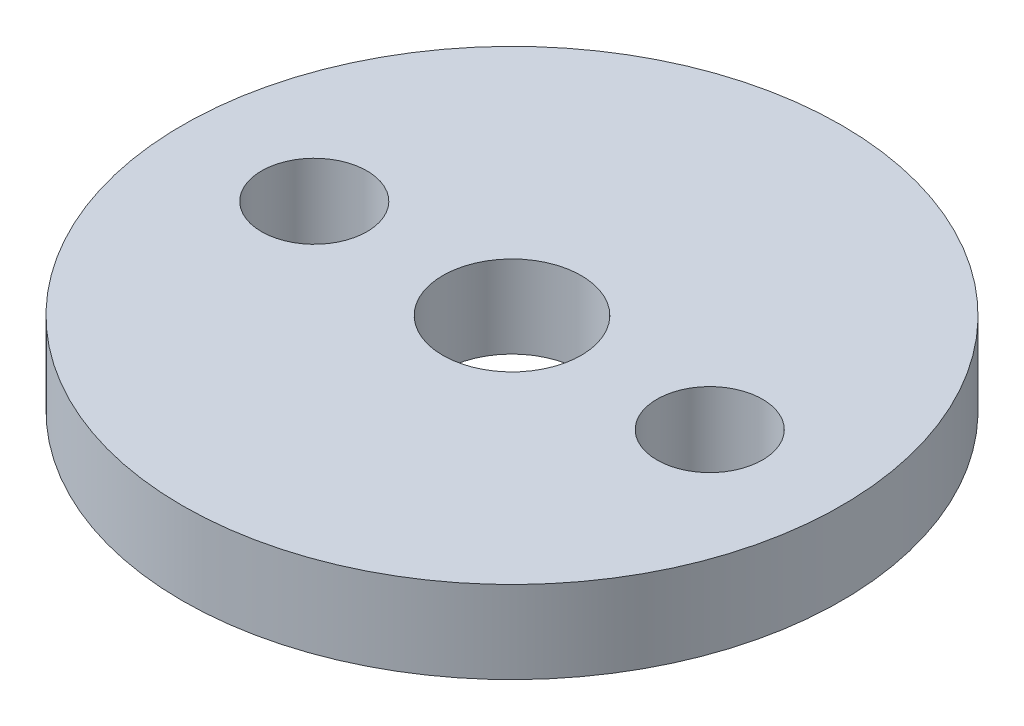
ISO-10303-21;
HEADER;
FILE_DESCRIPTION(('STEP AP214'),'2;1');
FILE_NAME('part.step','',(''),(''),'','','');
FILE_SCHEMA(('AUTOMOTIVE_DESIGN { 1 0 10303 214 1 1 1 1 }'));
ENDSEC;
DATA;
#1=APPLICATION_CONTEXT('core data for automotive mechanical design processes');
#2=APPLICATION_PROTOCOL_DEFINITION('international standard','automotive_design',2000,#1);
#3=PRODUCT_CONTEXT('',#1,'mechanical');
#4=PRODUCT('Part','Part','',(#3));
#5=PRODUCT_RELATED_PRODUCT_CATEGORY('part','',(#4));
#6=PRODUCT_DEFINITION_FORMATION('','',#4);
#7=PRODUCT_DEFINITION_CONTEXT('part definition',#1,'design');
#8=PRODUCT_DEFINITION('design','',#6,#7);
#9=PRODUCT_DEFINITION_SHAPE('','',#8);
#10=(LENGTH_UNIT() NAMED_UNIT(*) SI_UNIT(.MILLI.,.METRE.));
#11=(NAMED_UNIT(*) PLANE_ANGLE_UNIT() SI_UNIT($,.RADIAN.));
#12=(NAMED_UNIT(*) SI_UNIT($,.STERADIAN.) SOLID_ANGLE_UNIT());
#13=UNCERTAINTY_MEASURE_WITH_UNIT(LENGTH_MEASURE(1.E-05),#10,'distance_accuracy_value','');
#14=(GEOMETRIC_REPRESENTATION_CONTEXT(3) GLOBAL_UNCERTAINTY_ASSIGNED_CONTEXT((#13)) GLOBAL_UNIT_ASSIGNED_CONTEXT((#10,
#11,#12)) REPRESENTATION_CONTEXT('',''));
#15=CARTESIAN_POINT('',(0.,0.,0.));
#16=DIRECTION('',(0.,0.,1.));
#17=DIRECTION('',(1.,0.,0.));
#18=AXIS2_PLACEMENT_3D('',#15,#16,#17);
#19=CARTESIAN_POINT('',(0.,2.5,0.));
#20=DIRECTION('',(0.,-1.,0.));
#21=DIRECTION('',(0.,0.,-1.));
#22=AXIS2_PLACEMENT_3D('',#19,#20,#21);
#23=CYLINDRICAL_SURFACE('',#22,10.);
#24=CARTESIAN_POINT('',(0.,2.5,0.));
#25=DIRECTION('',(0.,1.,0.));
#26=DIRECTION('',(0.,0.,1.));
#27=AXIS2_PLACEMENT_3D('',#24,#25,#26);
#28=CIRCLE('',#27,10.);
#29=CARTESIAN_POINT('',(0.,2.5,10.));
#30=VERTEX_POINT('',#29);
#31=EDGE_CURVE('E10',#30,#30,#28,.T.);
#32=ORIENTED_EDGE('',*,*,#31,.F.);
#33=EDGE_LOOP('',(#32));
#34=FACE_BOUND('',#33,.T.);
#35=CARTESIAN_POINT('',(0.,0.,0.));
#36=DIRECTION('',(0.,1.,0.));
#37=DIRECTION('',(0.,0.,1.));
#38=AXIS2_PLACEMENT_3D('',#35,#36,#37);
#39=CIRCLE('',#38,10.);
#40=CARTESIAN_POINT('',(0.,0.,10.));
#41=VERTEX_POINT('',#40);
#42=EDGE_CURVE('E44',#41,#41,#39,.T.);
#43=ORIENTED_EDGE('',*,*,#42,.T.);
#44=EDGE_LOOP('',(#43));
#45=FACE_BOUND('',#44,.T.);
#46=ADVANCED_FACE('F37',(#34,#45),#23,.T.);
#47=CARTESIAN_POINT('',(0.,2.5,0.));
#48=DIRECTION('',(0.,1.,0.));
#49=DIRECTION('',(0.,0.,1.));
#50=AXIS2_PLACEMENT_3D('',#47,#48,#49);
#51=PLANE('',#50);
#52=CARTESIAN_POINT('',(-6.,2.5,0.));
#53=DIRECTION('',(0.,1.,0.));
#54=DIRECTION('',(0.,0.,1.));
#55=AXIS2_PLACEMENT_3D('',#52,#53,#54);
#56=CIRCLE('',#55,1.6);
#57=CARTESIAN_POINT('',(-6.,2.5,1.6));
#58=VERTEX_POINT('',#57);
#59=EDGE_CURVE('E104',#58,#58,#56,.T.);
#60=ORIENTED_EDGE('',*,*,#59,.F.);
#61=EDGE_LOOP('',(#60));
#62=FACE_BOUND('',#61,.T.);
#63=CARTESIAN_POINT('',(6.,2.5,0.));
#64=DIRECTION('',(0.,1.,0.));
#65=DIRECTION('',(0.,0.,1.));
#66=AXIS2_PLACEMENT_3D('',#63,#64,#65);
#67=CIRCLE('',#66,1.6);
#68=CARTESIAN_POINT('',(6.,2.5,1.6));
#69=VERTEX_POINT('',#68);
#70=EDGE_CURVE('E102',#69,#69,#67,.T.);
#71=ORIENTED_EDGE('',*,*,#70,.F.);
#72=EDGE_LOOP('',(#71));
#73=FACE_BOUND('',#72,.T.);
#74=CARTESIAN_POINT('',(0.,2.5,0.));
#75=DIRECTION('',(0.,1.,0.));
#76=DIRECTION('',(0.,0.,1.));
#77=AXIS2_PLACEMENT_3D('',#74,#75,#76);
#78=CIRCLE('',#77,2.1);
#79=CARTESIAN_POINT('',(0.,2.5,2.1));
#80=VERTEX_POINT('',#79);
#81=EDGE_CURVE('E51',#80,#80,#78,.T.);
#82=ORIENTED_EDGE('',*,*,#81,.F.);
#83=EDGE_LOOP('',(#82));
#84=FACE_BOUND('',#83,.T.);
#85=ORIENTED_EDGE('',*,*,#31,.T.);
#86=EDGE_LOOP('',(#85));
#87=FACE_BOUND('',#86,.T.);
#88=ADVANCED_FACE('F79',(#62,#73,#84,#87),#51,.T.);
#89=CARTESIAN_POINT('',(0.,0.,0.));
#90=DIRECTION('',(0.,1.,0.));
#91=DIRECTION('',(0.,0.,1.));
#92=AXIS2_PLACEMENT_3D('',#89,#90,#91);
#93=PLANE('',#92);
#94=CARTESIAN_POINT('',(-6.,0.,0.));
#95=DIRECTION('',(0.,1.,0.));
#96=DIRECTION('',(0.,0.,1.));
#97=AXIS2_PLACEMENT_3D('',#94,#95,#96);
#98=CIRCLE('',#97,1.6);
#99=CARTESIAN_POINT('',(-6.,0.,1.6));
#100=VERTEX_POINT('',#99);
#101=EDGE_CURVE('E40',#100,#100,#98,.T.);
#102=ORIENTED_EDGE('',*,*,#101,.T.);
#103=EDGE_LOOP('',(#102));
#104=FACE_BOUND('',#103,.T.);
#105=CARTESIAN_POINT('',(6.,0.,0.));
#106=DIRECTION('',(0.,1.,0.));
#107=DIRECTION('',(0.,0.,1.));
#108=AXIS2_PLACEMENT_3D('',#105,#106,#107);
#109=CIRCLE('',#108,1.6);
#110=CARTESIAN_POINT('',(6.,0.,1.6));
#111=VERTEX_POINT('',#110);
#112=EDGE_CURVE('E56',#111,#111,#109,.T.);
#113=ORIENTED_EDGE('',*,*,#112,.T.);
#114=EDGE_LOOP('',(#113));
#115=FACE_BOUND('',#114,.T.);
#116=CARTESIAN_POINT('',(0.,0.,0.));
#117=DIRECTION('',(0.,1.,0.));
#118=DIRECTION('',(0.,0.,1.));
#119=AXIS2_PLACEMENT_3D('',#116,#117,#118);
#120=CIRCLE('',#119,2.1);
#121=CARTESIAN_POINT('',(0.,0.,2.1));
#122=VERTEX_POINT('',#121);
#123=EDGE_CURVE('E54',#122,#122,#120,.T.);
#124=ORIENTED_EDGE('',*,*,#123,.T.);
#125=EDGE_LOOP('',(#124));
#126=FACE_BOUND('',#125,.T.);
#127=ORIENTED_EDGE('',*,*,#42,.F.);
#128=EDGE_LOOP('',(#127));
#129=FACE_BOUND('',#128,.T.);
#130=ADVANCED_FACE('F63',(#104,#115,#126,#129),#93,.F.);
#131=CARTESIAN_POINT('',(0.,-1.2E-05,0.));
#132=DIRECTION('',(0.,1.,0.));
#133=DIRECTION('',(0.,0.,1.));
#134=AXIS2_PLACEMENT_3D('',#131,#132,#133);
#135=CYLINDRICAL_SURFACE('',#134,2.1);
#136=CARTESIAN_POINT('',(0.,2.5,2.1));
#137=CARTESIAN_POINT('',(0.,2.47395833333333,2.1));
#138=CARTESIAN_POINT('',(0.,2.44791666666667,2.1));
#139=CARTESIAN_POINT('',(0.,2.39583333333333,2.1));
#140=CARTESIAN_POINT('',(0.,2.36979166666667,2.1));
#141=CARTESIAN_POINT('',(0.,2.31770833333333,2.1));
#142=CARTESIAN_POINT('',(0.,2.29166666666667,2.1));
#143=CARTESIAN_POINT('',(0.,2.23958333333333,2.1));
#144=CARTESIAN_POINT('',(0.,2.21354166666667,2.1));
#145=CARTESIAN_POINT('',(0.,2.16145833333333,2.1));
#146=CARTESIAN_POINT('',(0.,2.13541666666667,2.1));
#147=CARTESIAN_POINT('',(0.,2.08333333333333,2.1));
#148=CARTESIAN_POINT('',(0.,2.05729166666667,2.1));
#149=CARTESIAN_POINT('',(0.,2.00520833333333,2.1));
#150=CARTESIAN_POINT('',(0.,1.97916666666667,2.1));
#151=CARTESIAN_POINT('',(0.,1.92708333333333,2.1));
#152=CARTESIAN_POINT('',(0.,1.90104166666667,2.1));
#153=CARTESIAN_POINT('',(0.,1.84895833333333,2.1));
#154=CARTESIAN_POINT('',(0.,1.82291666666667,2.1));
#155=CARTESIAN_POINT('',(0.,1.77083333333333,2.1));
#156=CARTESIAN_POINT('',(0.,1.74479166666667,2.1));
#157=CARTESIAN_POINT('',(0.,1.69270833333333,2.1));
#158=CARTESIAN_POINT('',(0.,1.66666666666667,2.1));
#159=CARTESIAN_POINT('',(0.,1.61458333333333,2.1));
#160=CARTESIAN_POINT('',(0.,1.58854166666667,2.1));
#161=CARTESIAN_POINT('',(0.,1.53645833333333,2.1));
#162=CARTESIAN_POINT('',(0.,1.51041666666667,2.1));
#163=CARTESIAN_POINT('',(0.,1.45833333333333,2.1));
#164=CARTESIAN_POINT('',(0.,1.43229166666667,2.1));
#165=CARTESIAN_POINT('',(0.,1.38020833333333,2.1));
#166=CARTESIAN_POINT('',(0.,1.35416666666667,2.1));
#167=CARTESIAN_POINT('',(0.,1.30208333333333,2.1));
#168=CARTESIAN_POINT('',(0.,1.27604166666667,2.1));
#169=CARTESIAN_POINT('',(0.,1.22395833333333,2.1));
#170=CARTESIAN_POINT('',(0.,1.19791666666667,2.1));
#171=CARTESIAN_POINT('',(0.,1.14583333333333,2.1));
#172=CARTESIAN_POINT('',(0.,1.11979166666667,2.1));
#173=CARTESIAN_POINT('',(0.,1.06770833333333,2.1));
#174=CARTESIAN_POINT('',(0.,1.04166666666667,2.1));
#175=CARTESIAN_POINT('',(0.,0.989583333333333,2.1));
#176=CARTESIAN_POINT('',(0.,0.963541666666667,2.1));
#177=CARTESIAN_POINT('',(0.,0.911458333333333,2.1));
#178=CARTESIAN_POINT('',(0.,0.885416666666667,2.1));
#179=CARTESIAN_POINT('',(0.,0.833333333333333,2.1));
#180=CARTESIAN_POINT('',(0.,0.807291666666667,2.1));
#181=CARTESIAN_POINT('',(0.,0.755208333333333,2.1));
#182=CARTESIAN_POINT('',(0.,0.729166666666667,2.1));
#183=CARTESIAN_POINT('',(0.,0.677083333333333,2.1));
#184=CARTESIAN_POINT('',(0.,0.651041666666667,2.1));
#185=CARTESIAN_POINT('',(0.,0.598958333333333,2.1));
#186=CARTESIAN_POINT('',(0.,0.572916666666667,2.1));
#187=CARTESIAN_POINT('',(0.,0.520833333333333,2.1));
#188=CARTESIAN_POINT('',(0.,0.494791666666667,2.1));
#189=CARTESIAN_POINT('',(0.,0.442708333333333,2.1));
#190=CARTESIAN_POINT('',(0.,0.416666666666667,2.1));
#191=CARTESIAN_POINT('',(0.,0.364583333333333,2.1));
#192=CARTESIAN_POINT('',(0.,0.338541666666667,2.1));
#193=CARTESIAN_POINT('',(0.,0.286458333333333,2.1));
#194=CARTESIAN_POINT('',(0.,0.260416666666667,2.1));
#195=CARTESIAN_POINT('',(0.,0.208333333333334,2.1));
#196=CARTESIAN_POINT('',(0.,0.182291666666667,2.1));
#197=CARTESIAN_POINT('',(0.,0.130208333333334,2.1));
#198=CARTESIAN_POINT('',(0.,0.104166666666667,2.1));
#199=CARTESIAN_POINT('',(0.,0.0520833333333336,2.1));
#200=CARTESIAN_POINT('',(0.,0.0260416666666669,2.1));
#201=CARTESIAN_POINT('',(0.,0.,2.1));
#202=B_SPLINE_CURVE_WITH_KNOTS('',3,(#136,#137,#138,#139,#140,#141,#142,#143,#144,#145,#146,
#147,#148,#149,#150,#151,#152,#153,#154,#155,#156,#157,#158,#159,#160,#161,#162,#163,#164,#165,
#166,#167,#168,#169,#170,#171,#172,#173,#174,#175,#176,#177,#178,#179,#180,#181,#182,#183,#184,
#185,#186,#187,#188,#189,#190,#191,#192,#193,#194,#195,#196,#197,#198,#199,#200,#201),
.UNSPECIFIED.,.F.,.F.,(4,2,2,2,2,2,2,2,2,2,2,2,2,2,2,2,2,2,2,2,2,2,2,2,2,2,2,2,2,2,2,2,4),(0.,
0.0781250000000001,0.15625,0.234375,0.3125,0.390625,0.46875,0.546875,0.625,0.703125,0.78125,
0.859374999999999,0.9375,1.015625,1.09375,1.171875,1.25,1.328125,1.40625,1.484375,1.5625,
1.640625,1.71875,1.796875,1.875,1.953125,2.03125,2.109375,2.1875,2.265625,2.34375,2.421875,2.5),.UNSPECIFIED.);
#203=EDGE_CURVE('BSEAM73',#80,#122,#202,.T.);
#204=ORIENTED_EDGE('',*,*,#81,.T.);
#205=ORIENTED_EDGE('',*,*,#123,.F.);
#206=ORIENTED_EDGE('',*,*,#203,.T.);
#207=ORIENTED_EDGE('',*,*,#203,.F.);
#208=EDGE_LOOP('',(#204,#206,#205,#207));
#209=FACE_BOUND('',#208,.T.);
#210=ADVANCED_FACE('F73',(#209),#135,.F.);
#211=CARTESIAN_POINT('',(6.,-1.2E-05,0.));
#212=DIRECTION('',(0.,1.,0.));
#213=DIRECTION('',(0.,0.,1.));
#214=AXIS2_PLACEMENT_3D('',#211,#212,#213);
#215=CYLINDRICAL_SURFACE('',#214,1.6);
#216=CARTESIAN_POINT('',(6.,2.5,1.6));
#217=CARTESIAN_POINT('',(6.,2.47395833333333,1.6));
#218=CARTESIAN_POINT('',(6.,2.44791666666667,1.6));
#219=CARTESIAN_POINT('',(6.,2.39583333333333,1.6));
#220=CARTESIAN_POINT('',(6.,2.36979166666667,1.6));
#221=CARTESIAN_POINT('',(6.,2.31770833333333,1.6));
#222=CARTESIAN_POINT('',(6.,2.29166666666667,1.6));
#223=CARTESIAN_POINT('',(6.,2.23958333333333,1.6));
#224=CARTESIAN_POINT('',(6.,2.21354166666667,1.6));
#225=CARTESIAN_POINT('',(6.,2.16145833333333,1.6));
#226=CARTESIAN_POINT('',(6.,2.13541666666667,1.6));
#227=CARTESIAN_POINT('',(6.,2.08333333333333,1.6));
#228=CARTESIAN_POINT('',(6.,2.05729166666667,1.6));
#229=CARTESIAN_POINT('',(6.,2.00520833333333,1.6));
#230=CARTESIAN_POINT('',(6.,1.97916666666667,1.6));
#231=CARTESIAN_POINT('',(6.,1.92708333333333,1.6));
#232=CARTESIAN_POINT('',(6.,1.90104166666667,1.6));
#233=CARTESIAN_POINT('',(6.,1.84895833333333,1.6));
#234=CARTESIAN_POINT('',(6.,1.82291666666667,1.6));
#235=CARTESIAN_POINT('',(6.,1.77083333333333,1.6));
#236=CARTESIAN_POINT('',(6.,1.74479166666667,1.6));
#237=CARTESIAN_POINT('',(6.,1.69270833333333,1.6));
#238=CARTESIAN_POINT('',(6.,1.66666666666667,1.6));
#239=CARTESIAN_POINT('',(6.,1.61458333333333,1.6));
#240=CARTESIAN_POINT('',(6.,1.58854166666667,1.6));
#241=CARTESIAN_POINT('',(6.,1.53645833333333,1.6));
#242=CARTESIAN_POINT('',(6.,1.51041666666667,1.6));
#243=CARTESIAN_POINT('',(6.,1.45833333333333,1.6));
#244=CARTESIAN_POINT('',(6.,1.43229166666667,1.6));
#245=CARTESIAN_POINT('',(6.,1.38020833333333,1.6));
#246=CARTESIAN_POINT('',(6.,1.35416666666667,1.6));
#247=CARTESIAN_POINT('',(6.,1.30208333333333,1.6));
#248=CARTESIAN_POINT('',(6.,1.27604166666667,1.6));
#249=CARTESIAN_POINT('',(6.,1.22395833333333,1.6));
#250=CARTESIAN_POINT('',(6.,1.19791666666667,1.6));
#251=CARTESIAN_POINT('',(6.,1.14583333333333,1.6));
#252=CARTESIAN_POINT('',(6.,1.11979166666667,1.6));
#253=CARTESIAN_POINT('',(6.,1.06770833333333,1.6));
#254=CARTESIAN_POINT('',(6.,1.04166666666667,1.6));
#255=CARTESIAN_POINT('',(6.,0.989583333333333,1.6));
#256=CARTESIAN_POINT('',(6.,0.963541666666667,1.6));
#257=CARTESIAN_POINT('',(6.,0.911458333333333,1.6));
#258=CARTESIAN_POINT('',(6.,0.885416666666667,1.6));
#259=CARTESIAN_POINT('',(6.,0.833333333333333,1.6));
#260=CARTESIAN_POINT('',(6.,0.807291666666667,1.6));
#261=CARTESIAN_POINT('',(6.,0.755208333333333,1.6));
#262=CARTESIAN_POINT('',(6.,0.729166666666667,1.6));
#263=CARTESIAN_POINT('',(6.,0.677083333333333,1.6));
#264=CARTESIAN_POINT('',(6.,0.651041666666667,1.6));
#265=CARTESIAN_POINT('',(6.,0.598958333333333,1.6));
#266=CARTESIAN_POINT('',(6.,0.572916666666667,1.6));
#267=CARTESIAN_POINT('',(6.,0.520833333333333,1.6));
#268=CARTESIAN_POINT('',(6.,0.494791666666667,1.6));
#269=CARTESIAN_POINT('',(6.,0.442708333333333,1.6));
#270=CARTESIAN_POINT('',(6.,0.416666666666667,1.6));
#271=CARTESIAN_POINT('',(6.,0.364583333333333,1.6));
#272=CARTESIAN_POINT('',(6.,0.338541666666667,1.6));
#273=CARTESIAN_POINT('',(6.,0.286458333333333,1.6));
#274=CARTESIAN_POINT('',(6.,0.260416666666667,1.6));
#275=CARTESIAN_POINT('',(6.,0.208333333333334,1.6));
#276=CARTESIAN_POINT('',(6.,0.182291666666667,1.6));
#277=CARTESIAN_POINT('',(6.,0.130208333333334,1.6));
#278=CARTESIAN_POINT('',(6.,0.104166666666667,1.6));
#279=CARTESIAN_POINT('',(6.,0.0520833333333336,1.6));
#280=CARTESIAN_POINT('',(6.,0.0260416666666669,1.6));
#281=CARTESIAN_POINT('',(6.,0.,1.6));
#282=B_SPLINE_CURVE_WITH_KNOTS('',3,(#216,#217,#218,#219,#220,#221,#222,#223,#224,#225,#226,
#227,#228,#229,#230,#231,#232,#233,#234,#235,#236,#237,#238,#239,#240,#241,#242,#243,#244,#245,
#246,#247,#248,#249,#250,#251,#252,#253,#254,#255,#256,#257,#258,#259,#260,#261,#262,#263,#264,
#265,#266,#267,#268,#269,#270,#271,#272,#273,#274,#275,#276,#277,#278,#279,#280,#281),
.UNSPECIFIED.,.F.,.F.,(4,2,2,2,2,2,2,2,2,2,2,2,2,2,2,2,2,2,2,2,2,2,2,2,2,2,2,2,2,2,2,2,4),(0.,
0.0781250000000001,0.15625,0.234375,0.3125,0.390625,0.46875,0.546875,0.625,0.703125,0.78125,
0.859374999999999,0.9375,1.015625,1.09375,1.171875,1.25,1.328125,1.40625,1.484375,1.5625,
1.640625,1.71875,1.796875,1.875,1.953125,2.03125,2.109375,2.1875,2.265625,2.34375,2.421875,2.5),.UNSPECIFIED.);
#283=EDGE_CURVE('BSEAM67',#69,#111,#282,.T.);
#284=ORIENTED_EDGE('',*,*,#70,.T.);
#285=ORIENTED_EDGE('',*,*,#112,.F.);
#286=ORIENTED_EDGE('',*,*,#283,.T.);
#287=ORIENTED_EDGE('',*,*,#283,.F.);
#288=EDGE_LOOP('',(#284,#286,#285,#287));
#289=FACE_BOUND('',#288,.T.);
#290=ADVANCED_FACE('F67',(#289),#215,.F.);
#291=CARTESIAN_POINT('',(-6.,-1.2E-05,0.));
#292=DIRECTION('',(0.,1.,0.));
#293=DIRECTION('',(0.,0.,1.));
#294=AXIS2_PLACEMENT_3D('',#291,#292,#293);
#295=CYLINDRICAL_SURFACE('',#294,1.6);
#296=CARTESIAN_POINT('',(-6.,2.5,1.6));
#297=CARTESIAN_POINT('',(-6.,2.47395833333333,1.6));
#298=CARTESIAN_POINT('',(-6.,2.44791666666667,1.6));
#299=CARTESIAN_POINT('',(-6.,2.39583333333333,1.6));
#300=CARTESIAN_POINT('',(-6.,2.36979166666667,1.6));
#301=CARTESIAN_POINT('',(-6.,2.31770833333333,1.6));
#302=CARTESIAN_POINT('',(-6.,2.29166666666667,1.6));
#303=CARTESIAN_POINT('',(-6.,2.23958333333333,1.6));
#304=CARTESIAN_POINT('',(-6.,2.21354166666667,1.6));
#305=CARTESIAN_POINT('',(-6.,2.16145833333333,1.6));
#306=CARTESIAN_POINT('',(-6.,2.13541666666667,1.6));
#307=CARTESIAN_POINT('',(-6.,2.08333333333333,1.6));
#308=CARTESIAN_POINT('',(-6.,2.05729166666667,1.6));
#309=CARTESIAN_POINT('',(-6.,2.00520833333333,1.6));
#310=CARTESIAN_POINT('',(-6.,1.97916666666667,1.6));
#311=CARTESIAN_POINT('',(-6.,1.92708333333333,1.6));
#312=CARTESIAN_POINT('',(-6.,1.90104166666667,1.6));
#313=CARTESIAN_POINT('',(-6.,1.84895833333333,1.6));
#314=CARTESIAN_POINT('',(-6.,1.82291666666667,1.6));
#315=CARTESIAN_POINT('',(-6.,1.77083333333333,1.6));
#316=CARTESIAN_POINT('',(-6.,1.74479166666667,1.6));
#317=CARTESIAN_POINT('',(-6.,1.69270833333333,1.6));
#318=CARTESIAN_POINT('',(-6.,1.66666666666667,1.6));
#319=CARTESIAN_POINT('',(-6.,1.61458333333333,1.6));
#320=CARTESIAN_POINT('',(-6.,1.58854166666667,1.6));
#321=CARTESIAN_POINT('',(-6.,1.53645833333333,1.6));
#322=CARTESIAN_POINT('',(-6.,1.51041666666667,1.6));
#323=CARTESIAN_POINT('',(-6.,1.45833333333333,1.6));
#324=CARTESIAN_POINT('',(-6.,1.43229166666667,1.6));
#325=CARTESIAN_POINT('',(-6.,1.38020833333333,1.6));
#326=CARTESIAN_POINT('',(-6.,1.35416666666667,1.6));
#327=CARTESIAN_POINT('',(-6.,1.30208333333333,1.6));
#328=CARTESIAN_POINT('',(-6.,1.27604166666667,1.6));
#329=CARTESIAN_POINT('',(-6.,1.22395833333333,1.6));
#330=CARTESIAN_POINT('',(-6.,1.19791666666667,1.6));
#331=CARTESIAN_POINT('',(-6.,1.14583333333333,1.6));
#332=CARTESIAN_POINT('',(-6.,1.11979166666667,1.6));
#333=CARTESIAN_POINT('',(-6.,1.06770833333333,1.6));
#334=CARTESIAN_POINT('',(-6.,1.04166666666667,1.6));
#335=CARTESIAN_POINT('',(-6.,0.989583333333333,1.6));
#336=CARTESIAN_POINT('',(-6.,0.963541666666667,1.6));
#337=CARTESIAN_POINT('',(-6.,0.911458333333333,1.6));
#338=CARTESIAN_POINT('',(-6.,0.885416666666667,1.6));
#339=CARTESIAN_POINT('',(-6.,0.833333333333333,1.6));
#340=CARTESIAN_POINT('',(-6.,0.807291666666667,1.6));
#341=CARTESIAN_POINT('',(-6.,0.755208333333333,1.6));
#342=CARTESIAN_POINT('',(-6.,0.729166666666667,1.6));
#343=CARTESIAN_POINT('',(-6.,0.677083333333333,1.6));
#344=CARTESIAN_POINT('',(-6.,0.651041666666667,1.6));
#345=CARTESIAN_POINT('',(-6.,0.598958333333333,1.6));
#346=CARTESIAN_POINT('',(-6.,0.572916666666667,1.6));
#347=CARTESIAN_POINT('',(-6.,0.520833333333333,1.6));
#348=CARTESIAN_POINT('',(-6.,0.494791666666667,1.6));
#349=CARTESIAN_POINT('',(-6.,0.442708333333333,1.6));
#350=CARTESIAN_POINT('',(-6.,0.416666666666667,1.6));
#351=CARTESIAN_POINT('',(-6.,0.364583333333333,1.6));
#352=CARTESIAN_POINT('',(-6.,0.338541666666667,1.6));
#353=CARTESIAN_POINT('',(-6.,0.286458333333333,1.6));
#354=CARTESIAN_POINT('',(-6.,0.260416666666667,1.6));
#355=CARTESIAN_POINT('',(-6.,0.208333333333334,1.6));
#356=CARTESIAN_POINT('',(-6.,0.182291666666667,1.6));
#357=CARTESIAN_POINT('',(-6.,0.130208333333334,1.6));
#358=CARTESIAN_POINT('',(-6.,0.104166666666667,1.6));
#359=CARTESIAN_POINT('',(-6.,0.0520833333333336,1.6));
#360=CARTESIAN_POINT('',(-6.,0.0260416666666669,1.6));
#361=CARTESIAN_POINT('',(-6.,0.,1.6));
#362=B_SPLINE_CURVE_WITH_KNOTS('',3,(#296,#297,#298,#299,#300,#301,#302,#303,#304,#305,#306,
#307,#308,#309,#310,#311,#312,#313,#314,#315,#316,#317,#318,#319,#320,#321,#322,#323,#324,#325,
#326,#327,#328,#329,#330,#331,#332,#333,#334,#335,#336,#337,#338,#339,#340,#341,#342,#343,#344,
#345,#346,#347,#348,#349,#350,#351,#352,#353,#354,#355,#356,#357,#358,#359,#360,#361),
.UNSPECIFIED.,.F.,.F.,(4,2,2,2,2,2,2,2,2,2,2,2,2,2,2,2,2,2,2,2,2,2,2,2,2,2,2,2,2,2,2,2,4),(0.,
0.0781250000000001,0.15625,0.234375,0.3125,0.390625,0.46875,0.546875,0.625,0.703125,0.78125,
0.859374999999999,0.9375,1.015625,1.09375,1.171875,1.25,1.328125,1.40625,1.484375,1.5625,
1.640625,1.71875,1.796875,1.875,1.953125,2.03125,2.109375,2.1875,2.265625,2.34375,2.421875,2.5),.UNSPECIFIED.);
#363=EDGE_CURVE('BSEAM65',#58,#100,#362,.T.);
#364=ORIENTED_EDGE('',*,*,#59,.T.);
#365=ORIENTED_EDGE('',*,*,#101,.F.);
#366=ORIENTED_EDGE('',*,*,#363,.T.);
#367=ORIENTED_EDGE('',*,*,#363,.F.);
#368=EDGE_LOOP('',(#364,#366,#365,#367));
#369=FACE_BOUND('',#368,.T.);
#370=ADVANCED_FACE('F65',(#369),#295,.F.);
#371=CLOSED_SHELL('',(#46,#88,#130,#210,#290,#370));
#372=MANIFOLD_SOLID_BREP('B2',#371);
#373=ADVANCED_BREP_SHAPE_REPRESENTATION('',(#18,#372),#14);
#374=SHAPE_DEFINITION_REPRESENTATION(#9,#373);
ENDSEC;
END-ISO-10303-21;
